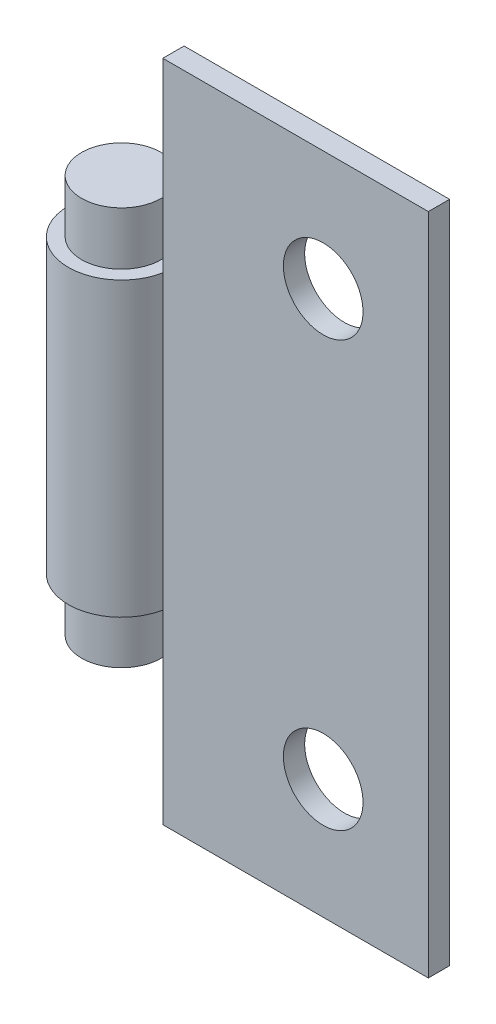
ISO-10303-21;
HEADER;
FILE_DESCRIPTION(('STEP AP214'),'2;1');
FILE_NAME('part.step','',(''),(''),'','','');
FILE_SCHEMA(('AUTOMOTIVE_DESIGN { 1 0 10303 214 1 1 1 1 }'));
ENDSEC;
DATA;
#1=APPLICATION_CONTEXT('core data for automotive mechanical design processes');
#2=APPLICATION_PROTOCOL_DEFINITION('international standard','automotive_design',2000,#1);
#3=PRODUCT_CONTEXT('',#1,'mechanical');
#4=PRODUCT('Part','Part','',(#3));
#5=PRODUCT_RELATED_PRODUCT_CATEGORY('part','',(#4));
#6=PRODUCT_DEFINITION_FORMATION('','',#4);
#7=PRODUCT_DEFINITION_CONTEXT('part definition',#1,'design');
#8=PRODUCT_DEFINITION('design','',#6,#7);
#9=PRODUCT_DEFINITION_SHAPE('','',#8);
#10=(LENGTH_UNIT() NAMED_UNIT(*) SI_UNIT(.MILLI.,.METRE.));
#11=(NAMED_UNIT(*) PLANE_ANGLE_UNIT() SI_UNIT($,.RADIAN.));
#12=(NAMED_UNIT(*) SI_UNIT($,.STERADIAN.) SOLID_ANGLE_UNIT());
#13=UNCERTAINTY_MEASURE_WITH_UNIT(LENGTH_MEASURE(1.E-05),#10,'distance_accuracy_value','');
#14=(GEOMETRIC_REPRESENTATION_CONTEXT(3) GLOBAL_UNCERTAINTY_ASSIGNED_CONTEXT((#13)) GLOBAL_UNIT_ASSIGNED_CONTEXT((#10,
#11,#12)) REPRESENTATION_CONTEXT('',''));
#15=CARTESIAN_POINT('',(0.,0.,0.));
#16=DIRECTION('',(0.,0.,1.));
#17=DIRECTION('',(1.,0.,0.));
#18=AXIS2_PLACEMENT_3D('',#15,#16,#17);
#19=CARTESIAN_POINT('',(-5.,-12.5,0.8));
#20=DIRECTION('',(1.,0.,0.));
#21=DIRECTION('',(0.,0.,-1.));
#22=AXIS2_PLACEMENT_3D('',#19,#20,#21);
#23=PLANE('',#22);
#24=DIRECTION('',(0.,0.,1.));
#25=VECTOR('',#24,1.);
#26=CARTESIAN_POINT('',(-5.,-5.5,0.8));
#27=LINE('',#26,#25);
#28=CARTESIAN_POINT('',(-5.,-5.5,0.));
#29=VERTEX_POINT('',#28);
#30=CARTESIAN_POINT('',(-5.,-5.5,0.8));
#31=VERTEX_POINT('',#30);
#32=EDGE_CURVE('E108',#29,#31,#27,.T.);
#33=ORIENTED_EDGE('',*,*,#32,.F.);
#34=DIRECTION('',(0.,-1.,0.));
#35=VECTOR('',#34,1.);
#36=CARTESIAN_POINT('',(-5.,-12.5,0.));
#37=LINE('',#36,#35);
#38=CARTESIAN_POINT('',(-5.,-12.5,0.));
#39=VERTEX_POINT('',#38);
#40=EDGE_CURVE('E96',#29,#39,#37,.T.);
#41=ORIENTED_EDGE('',*,*,#40,.T.);
#42=DIRECTION('',(0.,0.,-1.));
#43=VECTOR('',#42,1.);
#44=CARTESIAN_POINT('',(-5.,-12.5,0.8));
#45=LINE('',#44,#43);
#46=CARTESIAN_POINT('',(-5.,-12.5,0.8));
#47=VERTEX_POINT('',#46);
#48=EDGE_CURVE('E148',#47,#39,#45,.T.);
#49=ORIENTED_EDGE('',*,*,#48,.F.);
#50=DIRECTION('',(0.,-1.,0.));
#51=VECTOR('',#50,1.);
#52=CARTESIAN_POINT('',(-5.,-12.5,0.8));
#53=LINE('',#52,#51);
#54=EDGE_CURVE('E56',#31,#47,#53,.T.);
#55=ORIENTED_EDGE('',*,*,#54,.F.);
#56=EDGE_LOOP('',(#33,#41,#49,#55));
#57=FACE_BOUND('',#56,.T.);
#58=ADVANCED_FACE('F39',(#57),#23,.F.);
#59=CARTESIAN_POINT('',(5.,-12.5,0.8));
#60=DIRECTION('',(-1.,0.,0.));
#61=DIRECTION('',(0.,0.,1.));
#62=AXIS2_PLACEMENT_3D('',#59,#60,#61);
#63=PLANE('',#62);
#64=DIRECTION('',(0.,1.,0.));
#65=VECTOR('',#64,1.);
#66=CARTESIAN_POINT('',(5.,-12.5,0.));
#67=LINE('',#66,#65);
#68=CARTESIAN_POINT('',(5.,-12.5,0.));
#69=VERTEX_POINT('',#68);
#70=CARTESIAN_POINT('',(5.,12.5,0.));
#71=VERTEX_POINT('',#70);
#72=EDGE_CURVE('E131',#69,#71,#67,.T.);
#73=ORIENTED_EDGE('',*,*,#72,.T.);
#74=DIRECTION('',(0.,0.,-1.));
#75=VECTOR('',#74,1.);
#76=CARTESIAN_POINT('',(5.,12.5,0.8));
#77=LINE('',#76,#75);
#78=CARTESIAN_POINT('',(5.,12.5,0.8));
#79=VERTEX_POINT('',#78);
#80=EDGE_CURVE('E11',#79,#71,#77,.T.);
#81=ORIENTED_EDGE('',*,*,#80,.F.);
#82=DIRECTION('',(0.,1.,0.));
#83=VECTOR('',#82,1.);
#84=CARTESIAN_POINT('',(5.,-12.5,0.8));
#85=LINE('',#84,#83);
#86=CARTESIAN_POINT('',(5.,-12.5,0.8));
#87=VERTEX_POINT('',#86);
#88=EDGE_CURVE('E132',#87,#79,#85,.T.);
#89=ORIENTED_EDGE('',*,*,#88,.F.);
#90=DIRECTION('',(0.,0.,-1.));
#91=VECTOR('',#90,1.);
#92=CARTESIAN_POINT('',(5.,-12.5,0.8));
#93=LINE('',#92,#91);
#94=EDGE_CURVE('E141',#87,#69,#93,.T.);
#95=ORIENTED_EDGE('',*,*,#94,.T.);
#96=EDGE_LOOP('',(#73,#81,#89,#95));
#97=FACE_BOUND('',#96,.T.);
#98=ADVANCED_FACE('F41',(#97),#63,.F.);
#99=CARTESIAN_POINT('',(-5.,12.5,0.8));
#100=DIRECTION('',(0.,-1.,0.));
#101=DIRECTION('',(0.,0.,-1.));
#102=AXIS2_PLACEMENT_3D('',#99,#100,#101);
#103=PLANE('',#102);
#104=DIRECTION('',(-1.,0.,0.));
#105=VECTOR('',#104,1.);
#106=CARTESIAN_POINT('',(-5.,12.5,0.));
#107=LINE('',#106,#105);
#108=CARTESIAN_POINT('',(-5.,12.5,0.));
#109=VERTEX_POINT('',#108);
#110=EDGE_CURVE('E104',#71,#109,#107,.T.);
#111=ORIENTED_EDGE('',*,*,#110,.T.);
#112=DIRECTION('',(0.,0.,-1.));
#113=VECTOR('',#112,1.);
#114=CARTESIAN_POINT('',(-5.,12.5,0.8));
#115=LINE('',#114,#113);
#116=CARTESIAN_POINT('',(-5.,12.5,0.8));
#117=VERTEX_POINT('',#116);
#118=EDGE_CURVE('E48',#117,#109,#115,.T.);
#119=ORIENTED_EDGE('',*,*,#118,.F.);
#120=DIRECTION('',(-1.,0.,0.));
#121=VECTOR('',#120,1.);
#122=CARTESIAN_POINT('',(-5.,12.5,0.8));
#123=LINE('',#122,#121);
#124=EDGE_CURVE('E135',#79,#117,#123,.T.);
#125=ORIENTED_EDGE('',*,*,#124,.F.);
#126=ORIENTED_EDGE('',*,*,#80,.T.);
#127=EDGE_LOOP('',(#111,#119,#125,#126));
#128=FACE_BOUND('',#127,.T.);
#129=ADVANCED_FACE('F155',(#128),#103,.F.);
#130=CARTESIAN_POINT('',(-5.,5.5,0.));
#131=VERTEX_POINT('',#130);
#132=EDGE_CURVE('E106',#109,#131,#37,.T.);
#133=ORIENTED_EDGE('',*,*,#132,.T.);
#134=DIRECTION('',(0.,0.,1.));
#135=VECTOR('',#134,1.);
#136=CARTESIAN_POINT('',(-5.,5.5,0.8));
#137=LINE('',#136,#135);
#138=CARTESIAN_POINT('',(-5.,5.5,0.8));
#139=VERTEX_POINT('',#138);
#140=EDGE_CURVE('E64',#131,#139,#137,.T.);
#141=ORIENTED_EDGE('',*,*,#140,.T.);
#142=EDGE_CURVE('E137',#117,#139,#53,.T.);
#143=ORIENTED_EDGE('',*,*,#142,.F.);
#144=ORIENTED_EDGE('',*,*,#118,.T.);
#145=EDGE_LOOP('',(#133,#141,#143,#144));
#146=FACE_BOUND('',#145,.T.);
#147=ADVANCED_FACE('F152',(#146),#23,.F.);
#148=CARTESIAN_POINT('',(-5.,-12.5,0.8));
#149=DIRECTION('',(0.,1.,0.));
#150=DIRECTION('',(0.,0.,1.));
#151=AXIS2_PLACEMENT_3D('',#148,#149,#150);
#152=PLANE('',#151);
#153=DIRECTION('',(1.,0.,0.));
#154=VECTOR('',#153,1.);
#155=CARTESIAN_POINT('',(-5.,-12.5,0.));
#156=LINE('',#155,#154);
#157=EDGE_CURVE('E102',#39,#69,#156,.T.);
#158=ORIENTED_EDGE('',*,*,#157,.T.);
#159=ORIENTED_EDGE('',*,*,#94,.F.);
#160=DIRECTION('',(1.,0.,0.));
#161=VECTOR('',#160,1.);
#162=CARTESIAN_POINT('',(-5.,-12.5,0.8));
#163=LINE('',#162,#161);
#164=EDGE_CURVE('E139',#47,#87,#163,.T.);
#165=ORIENTED_EDGE('',*,*,#164,.F.);
#166=ORIENTED_EDGE('',*,*,#48,.T.);
#167=EDGE_LOOP('',(#158,#159,#165,#166));
#168=FACE_BOUND('',#167,.T.);
#169=ADVANCED_FACE('F161',(#168),#152,.F.);
#170=CARTESIAN_POINT('',(0.,0.,0.8));
#171=DIRECTION('',(0.,0.,-1.));
#172=DIRECTION('',(-1.,0.,0.));
#173=AXIS2_PLACEMENT_3D('',#170,#171,#172);
#174=PLANE('',#173);
#175=CARTESIAN_POINT('',(1.04040820577346,8.,0.8));
#176=DIRECTION('',(0.,0.,-1.));
#177=DIRECTION('',(-1.,0.,0.));
#178=AXIS2_PLACEMENT_3D('',#175,#176,#177);
#179=CIRCLE('',#178,1.5);
#180=CARTESIAN_POINT('',(-0.459591794226541,8.,0.8));
#181=VERTEX_POINT('',#180);
#182=EDGE_CURVE('E340',#181,#181,#179,.T.);
#183=ORIENTED_EDGE('',*,*,#182,.T.);
#184=EDGE_LOOP('',(#183));
#185=FACE_BOUND('',#184,.T.);
#186=CARTESIAN_POINT('',(1.04040820577346,-8.,0.8));
#187=DIRECTION('',(0.,0.,-1.));
#188=DIRECTION('',(-1.,0.,0.));
#189=AXIS2_PLACEMENT_3D('',#186,#187,#188);
#190=CIRCLE('',#189,1.5);
#191=CARTESIAN_POINT('',(-0.459591794226542,-8.,0.8));
#192=VERTEX_POINT('',#191);
#193=EDGE_CURVE('E342',#192,#192,#190,.T.);
#194=ORIENTED_EDGE('',*,*,#193,.T.);
#195=EDGE_LOOP('',(#194));
#196=FACE_BOUND('',#195,.T.);
#197=ORIENTED_EDGE('',*,*,#88,.T.);
#198=ORIENTED_EDGE('',*,*,#124,.T.);
#199=ORIENTED_EDGE('',*,*,#142,.T.);
#200=DIRECTION('',(0.,-1.,0.));
#201=VECTOR('',#200,1.);
#202=CARTESIAN_POINT('',(-5.,5.5,0.8));
#203=LINE('',#202,#201);
#204=EDGE_CURVE('E129',#31,#139,#203,.F.);
#205=ORIENTED_EDGE('',*,*,#204,.F.);
#206=ORIENTED_EDGE('',*,*,#54,.T.);
#207=ORIENTED_EDGE('',*,*,#164,.T.);
#208=EDGE_LOOP('',(#197,#198,#199,#205,#206,#207));
#209=FACE_BOUND('',#208,.T.);
#210=ADVANCED_FACE('F163',(#185,#196,#209),#174,.F.);
#211=CARTESIAN_POINT('',(0.,0.,0.));
#212=DIRECTION('',(0.,0.,-1.));
#213=DIRECTION('',(-1.,0.,0.));
#214=AXIS2_PLACEMENT_3D('',#211,#212,#213);
#215=PLANE('',#214);
#216=CARTESIAN_POINT('',(1.04040820577346,8.,0.));
#217=DIRECTION('',(0.,0.,-1.));
#218=DIRECTION('',(-1.,0.,0.));
#219=AXIS2_PLACEMENT_3D('',#216,#217,#218);
#220=CIRCLE('',#219,1.5);
#221=CARTESIAN_POINT('',(-0.459591794226541,8.,0.));
#222=VERTEX_POINT('',#221);
#223=EDGE_CURVE('E337',#222,#222,#220,.T.);
#224=ORIENTED_EDGE('',*,*,#223,.F.);
#225=EDGE_LOOP('',(#224));
#226=FACE_BOUND('',#225,.T.);
#227=CARTESIAN_POINT('',(1.04040820577346,-8.,0.));
#228=DIRECTION('',(0.,0.,-1.));
#229=DIRECTION('',(-1.,0.,0.));
#230=AXIS2_PLACEMENT_3D('',#227,#228,#229);
#231=CIRCLE('',#230,1.5);
#232=CARTESIAN_POINT('',(-0.459591794226542,-8.,0.));
#233=VERTEX_POINT('',#232);
#234=EDGE_CURVE('E355',#233,#233,#231,.T.);
#235=ORIENTED_EDGE('',*,*,#234,.F.);
#236=EDGE_LOOP('',(#235));
#237=FACE_BOUND('',#236,.T.);
#238=ORIENTED_EDGE('',*,*,#72,.F.);
#239=ORIENTED_EDGE('',*,*,#157,.F.);
#240=ORIENTED_EDGE('',*,*,#40,.F.);
#241=EDGE_CURVE('E101',#131,#29,#37,.T.);
#242=ORIENTED_EDGE('',*,*,#241,.F.);
#243=ORIENTED_EDGE('',*,*,#132,.F.);
#244=ORIENTED_EDGE('',*,*,#110,.F.);
#245=EDGE_LOOP('',(#238,#239,#240,#242,#243,#244));
#246=FACE_BOUND('',#245,.T.);
#247=ADVANCED_FACE('F98',(#226,#237,#246),#215,.T.);
#248=CARTESIAN_POINT('',(-6.95959179422654,5.5,0.4));
#249=DIRECTION('',(0.,-1.,0.));
#250=DIRECTION('',(0.,0.,-1.));
#251=AXIS2_PLACEMENT_3D('',#248,#249,#250);
#252=CYLINDRICAL_SURFACE('',#251,2.);
#253=CARTESIAN_POINT('',(-6.95959179422654,-5.5,0.4));
#254=DIRECTION('',(0.,1.,0.));
#255=DIRECTION('',(0.,0.,1.));
#256=AXIS2_PLACEMENT_3D('',#253,#254,#255);
#257=CIRCLE('',#256,2.);
#258=EDGE_CURVE('E118',#29,#31,#257,.T.);
#259=ORIENTED_EDGE('',*,*,#258,.T.);
#260=ORIENTED_EDGE('',*,*,#204,.T.);
#261=CARTESIAN_POINT('',(-6.95959179422654,5.5,0.4));
#262=DIRECTION('',(0.,1.,0.));
#263=DIRECTION('',(0.,0.,1.));
#264=AXIS2_PLACEMENT_3D('',#261,#262,#263);
#265=CIRCLE('',#264,2.);
#266=EDGE_CURVE('E112',#131,#139,#265,.T.);
#267=ORIENTED_EDGE('',*,*,#266,.F.);
#268=ORIENTED_EDGE('',*,*,#241,.T.);
#269=EDGE_LOOP('',(#259,#260,#267,#268));
#270=FACE_BOUND('',#269,.T.);
#271=ADVANCED_FACE('F116',(#270),#252,.T.);
#272=CARTESIAN_POINT('',(-6.95959179422654,5.5,0.4));
#273=DIRECTION('',(0.,1.,0.));
#274=DIRECTION('',(0.,0.,1.));
#275=AXIS2_PLACEMENT_3D('',#272,#273,#274);
#276=PLANE('',#275);
#277=CARTESIAN_POINT('',(-6.95959179422654,5.5,0.4));
#278=DIRECTION('',(0.,1.,0.));
#279=DIRECTION('',(0.,0.,1.));
#280=AXIS2_PLACEMENT_3D('',#277,#278,#279);
#281=CIRCLE('',#280,1.5);
#282=CARTESIAN_POINT('',(-6.95959179422654,5.5,1.9));
#283=VERTEX_POINT('',#282);
#284=EDGE_CURVE('E121',#283,#283,#281,.F.);
#285=ORIENTED_EDGE('',*,*,#284,.T.);
#286=EDGE_LOOP('',(#285));
#287=FACE_BOUND('',#286,.T.);
#288=ORIENTED_EDGE('',*,*,#140,.F.);
#289=ORIENTED_EDGE('',*,*,#266,.T.);
#290=EDGE_LOOP('',(#288,#289));
#291=FACE_BOUND('',#290,.T.);
#292=ADVANCED_FACE('F165',(#287,#291),#276,.T.);
#293=CARTESIAN_POINT('',(-6.95959179422654,-5.5,0.4));
#294=DIRECTION('',(0.,1.,0.));
#295=DIRECTION('',(0.,0.,1.));
#296=AXIS2_PLACEMENT_3D('',#293,#294,#295);
#297=PLANE('',#296);
#298=CARTESIAN_POINT('',(-6.95959179422654,-5.5,0.4));
#299=DIRECTION('',(0.,1.,0.));
#300=DIRECTION('',(0.,0.,1.));
#301=AXIS2_PLACEMENT_3D('',#298,#299,#300);
#302=CIRCLE('',#301,1.5);
#303=CARTESIAN_POINT('',(-6.95959179422654,-5.5,1.9));
#304=VERTEX_POINT('',#303);
#305=EDGE_CURVE('E43',#304,#304,#302,.T.);
#306=ORIENTED_EDGE('',*,*,#305,.T.);
#307=EDGE_LOOP('',(#306));
#308=FACE_BOUND('',#307,.T.);
#309=ORIENTED_EDGE('',*,*,#258,.F.);
#310=ORIENTED_EDGE('',*,*,#32,.T.);
#311=EDGE_LOOP('',(#309,#310));
#312=FACE_BOUND('',#311,.T.);
#313=ADVANCED_FACE('F120',(#308,#312),#297,.F.);
#314=CARTESIAN_POINT('',(-6.95959179422654,7.5,0.4));
#315=DIRECTION('',(0.,-1.,0.));
#316=DIRECTION('',(0.,0.,-1.));
#317=AXIS2_PLACEMENT_3D('',#314,#315,#316);
#318=CYLINDRICAL_SURFACE('',#317,1.5);
#319=ORIENTED_EDGE('',*,*,#284,.F.);
#320=EDGE_LOOP('',(#319));
#321=FACE_BOUND('',#320,.T.);
#322=CARTESIAN_POINT('',(-6.95959179422654,7.5,0.4));
#323=DIRECTION('',(0.,1.,0.));
#324=DIRECTION('',(0.,0.,1.));
#325=AXIS2_PLACEMENT_3D('',#322,#323,#324);
#326=CIRCLE('',#325,1.5);
#327=CARTESIAN_POINT('',(-6.95959179422654,7.5,1.9));
#328=VERTEX_POINT('',#327);
#329=EDGE_CURVE('E125',#328,#328,#326,.T.);
#330=ORIENTED_EDGE('',*,*,#329,.F.);
#331=EDGE_LOOP('',(#330));
#332=FACE_BOUND('',#331,.T.);
#333=ADVANCED_FACE('F173',(#321,#332),#318,.T.);
#334=CARTESIAN_POINT('',(-6.95959179422654,7.5,0.4));
#335=DIRECTION('',(0.,1.,0.));
#336=DIRECTION('',(0.,0.,1.));
#337=AXIS2_PLACEMENT_3D('',#334,#335,#336);
#338=PLANE('',#337);
#339=ORIENTED_EDGE('',*,*,#329,.T.);
#340=EDGE_LOOP('',(#339));
#341=FACE_BOUND('',#340,.T.);
#342=ADVANCED_FACE('F274',(#341),#338,.T.);
#343=CARTESIAN_POINT('',(-6.95959179422654,-7.5,0.4));
#344=DIRECTION('',(0.,1.,0.));
#345=DIRECTION('',(0.,0.,1.));
#346=AXIS2_PLACEMENT_3D('',#343,#344,#345);
#347=CYLINDRICAL_SURFACE('',#346,1.5);
#348=CARTESIAN_POINT('',(-6.95959179422654,-7.5,0.4));
#349=DIRECTION('',(0.,1.,0.));
#350=DIRECTION('',(0.,0.,1.));
#351=AXIS2_PLACEMENT_3D('',#348,#349,#350);
#352=CIRCLE('',#351,1.5);
#353=CARTESIAN_POINT('',(-6.95959179422654,-7.5,1.9));
#354=VERTEX_POINT('',#353);
#355=EDGE_CURVE('E341',#354,#354,#352,.T.);
#356=ORIENTED_EDGE('',*,*,#355,.T.);
#357=EDGE_LOOP('',(#356));
#358=FACE_BOUND('',#357,.T.);
#359=ORIENTED_EDGE('',*,*,#305,.F.);
#360=EDGE_LOOP('',(#359));
#361=FACE_BOUND('',#360,.T.);
#362=ADVANCED_FACE('F283',(#358,#361),#347,.T.);
#363=CARTESIAN_POINT('',(-6.95959179422654,-7.5,0.4));
#364=DIRECTION('',(0.,-1.,0.));
#365=DIRECTION('',(0.,0.,1.));
#366=AXIS2_PLACEMENT_3D('',#363,#364,#365);
#367=PLANE('',#366);
#368=ORIENTED_EDGE('',*,*,#355,.F.);
#369=EDGE_LOOP('',(#368));
#370=FACE_BOUND('',#369,.T.);
#371=ADVANCED_FACE('F293',(#370),#367,.T.);
#372=CARTESIAN_POINT('',(1.04040820577346,-8.,4.));
#373=DIRECTION('',(0.,0.,-1.));
#374=DIRECTION('',(-1.,0.,0.));
#375=AXIS2_PLACEMENT_3D('',#372,#373,#374);
#376=CYLINDRICAL_SURFACE('',#375,1.5);
#377=ORIENTED_EDGE('',*,*,#234,.T.);
#378=EDGE_LOOP('',(#377));
#379=FACE_BOUND('',#378,.T.);
#380=ORIENTED_EDGE('',*,*,#193,.F.);
#381=EDGE_LOOP('',(#380));
#382=FACE_BOUND('',#381,.T.);
#383=ADVANCED_FACE('F303',(#379,#382),#376,.F.);
#384=CARTESIAN_POINT('',(1.04040820577346,8.,4.));
#385=DIRECTION('',(0.,0.,-1.));
#386=DIRECTION('',(-1.,0.,0.));
#387=AXIS2_PLACEMENT_3D('',#384,#385,#386);
#388=CYLINDRICAL_SURFACE('',#387,1.5);
#389=ORIENTED_EDGE('',*,*,#223,.T.);
#390=EDGE_LOOP('',(#389));
#391=FACE_BOUND('',#390,.T.);
#392=ORIENTED_EDGE('',*,*,#182,.F.);
#393=EDGE_LOOP('',(#392));
#394=FACE_BOUND('',#393,.T.);
#395=ADVANCED_FACE('F313',(#391,#394),#388,.F.);
#396=CLOSED_SHELL('',(#58,#98,#129,#147,#169,#210,#247,#271,#292,#313,#333,#342,#362,#371,#383,#395));
#397=MANIFOLD_SOLID_BREP('B2',#396);
#398=ADVANCED_BREP_SHAPE_REPRESENTATION('',(#18,#397),#14);
#399=SHAPE_DEFINITION_REPRESENTATION(#9,#398);
ENDSEC;
END-ISO-10303-21;
